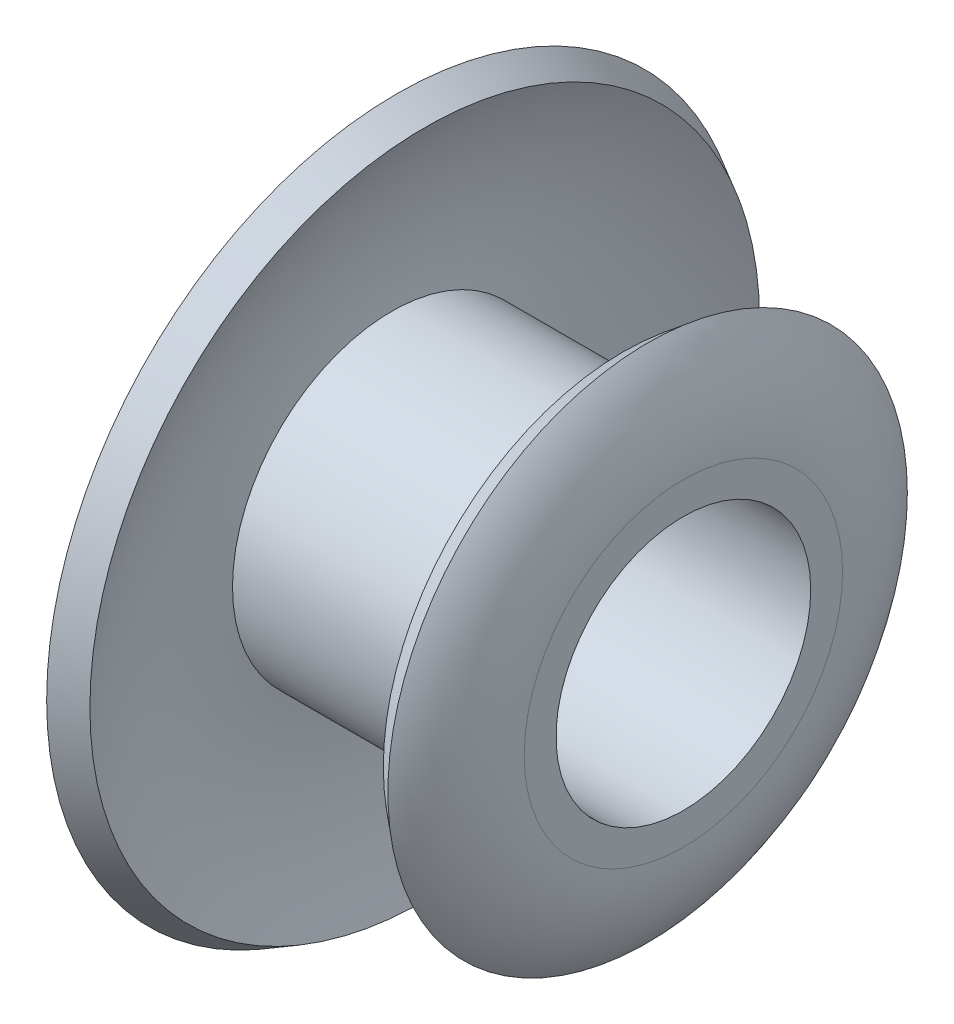
ISO-10303-21;
HEADER;
FILE_DESCRIPTION(('STEP AP214'),'2;1');
FILE_NAME('part.step','',(''),(''),'','','');
FILE_SCHEMA(('AUTOMOTIVE_DESIGN { 1 0 10303 214 1 1 1 1 }'));
ENDSEC;
DATA;
#1=APPLICATION_CONTEXT('core data for automotive mechanical design processes');
#2=APPLICATION_PROTOCOL_DEFINITION('international standard','automotive_design',2000,#1);
#3=PRODUCT_CONTEXT('',#1,'mechanical');
#4=PRODUCT('Part','Part','',(#3));
#5=PRODUCT_RELATED_PRODUCT_CATEGORY('part','',(#4));
#6=PRODUCT_DEFINITION_FORMATION('','',#4);
#7=PRODUCT_DEFINITION_CONTEXT('part definition',#1,'design');
#8=PRODUCT_DEFINITION('design','',#6,#7);
#9=PRODUCT_DEFINITION_SHAPE('','',#8);
#10=(LENGTH_UNIT() NAMED_UNIT(*) SI_UNIT(.MILLI.,.METRE.));
#11=(NAMED_UNIT(*) PLANE_ANGLE_UNIT() SI_UNIT($,.RADIAN.));
#12=(NAMED_UNIT(*) SI_UNIT($,.STERADIAN.) SOLID_ANGLE_UNIT());
#13=UNCERTAINTY_MEASURE_WITH_UNIT(LENGTH_MEASURE(1.E-05),#10,'distance_accuracy_value','');
#14=(GEOMETRIC_REPRESENTATION_CONTEXT(3) GLOBAL_UNCERTAINTY_ASSIGNED_CONTEXT((#13)) GLOBAL_UNIT_ASSIGNED_CONTEXT((#10,
#11,#12)) REPRESENTATION_CONTEXT('',''));
#15=CARTESIAN_POINT('',(0.,0.,0.));
#16=DIRECTION('',(0.,0.,1.));
#17=DIRECTION('',(1.,0.,0.));
#18=AXIS2_PLACEMENT_3D('',#15,#16,#17);
#19=CARTESIAN_POINT('',(-1.,0.,0.));
#20=DIRECTION('',(1.,0.,0.));
#21=DIRECTION('',(0.,0.,-1.));
#22=AXIS2_PLACEMENT_3D('',#19,#20,#21);
#23=TOROIDAL_SURFACE('',#22,1.25,1.);
#24=CARTESIAN_POINT('',(-0.224797408225479,0.,0.));
#25=DIRECTION('',(1.,0.,0.));
#26=DIRECTION('',(0.,0.,-1.));
#27=AXIS2_PLACEMENT_3D('',#24,#25,#26);
#28=CIRCLE('',#27,1.88171270503771);
#29=CARTESIAN_POINT('',(-0.224797408225479,0.,-1.88171270503771));
#30=VERTEX_POINT('',#29);
#31=EDGE_CURVE('E80',#30,#30,#28,.T.);
#32=ORIENTED_EDGE('',*,*,#31,.F.);
#33=EDGE_LOOP('',(#32));
#34=FACE_BOUND('',#33,.T.);
#35=CARTESIAN_POINT('',(0.,0.,0.));
#36=DIRECTION('',(1.,0.,0.));
#37=DIRECTION('',(0.,0.,-1.));
#38=AXIS2_PLACEMENT_3D('',#35,#36,#37);
#39=CIRCLE('',#38,1.25);
#40=CARTESIAN_POINT('',(0.,0.,-1.25));
#41=VERTEX_POINT('',#40);
#42=EDGE_CURVE('E10',#41,#41,#39,.T.);
#43=ORIENTED_EDGE('',*,*,#42,.T.);
#44=EDGE_LOOP('',(#43));
#45=FACE_BOUND('',#44,.T.);
#46=ADVANCED_FACE('F39',(#34,#45),#23,.F.);
#47=CARTESIAN_POINT('',(0.,0.,0.));
#48=DIRECTION('',(1.,0.,0.));
#49=DIRECTION('',(0.,0.,-1.));
#50=AXIS2_PLACEMENT_3D('',#47,#48,#49);
#51=CYLINDRICAL_SURFACE('',#50,1.25);
#52=ORIENTED_EDGE('',*,*,#42,.F.);
#53=EDGE_LOOP('',(#52));
#54=FACE_BOUND('',#53,.T.);
#55=CARTESIAN_POINT('',(-2.04063984282907,0.,0.));
#56=DIRECTION('',(1.,0.,0.));
#57=DIRECTION('',(0.,0.,-1.));
#58=AXIS2_PLACEMENT_3D('',#55,#56,#57);
#59=CIRCLE('',#58,1.25);
#60=CARTESIAN_POINT('',(-2.04063984282907,0.,-1.25));
#61=VERTEX_POINT('',#60);
#62=EDGE_CURVE('E46',#61,#61,#59,.T.);
#63=ORIENTED_EDGE('',*,*,#62,.T.);
#64=EDGE_LOOP('',(#63));
#65=FACE_BOUND('',#64,.T.);
#66=ADVANCED_FACE('F89',(#54,#65),#51,.T.);
#67=CARTESIAN_POINT('',(0.190032397181517,0.,0.));
#68=DIRECTION('',(1.,0.,0.));
#69=DIRECTION('',(0.,0.,-1.));
#70=AXIS2_PLACEMENT_3D('',#67,#68,#69);
#71=DEGENERATE_TOROIDAL_SURFACE('',#70,1.54428108611693,2.25,.T.);
#72=CARTESIAN_POINT('',(-1.78099676028185,0.,0.));
#73=DIRECTION('',(1.,0.,0.));
#74=DIRECTION('',(0.,0.,-1.));
#75=AXIS2_PLACEMENT_3D('',#72,#73,#74);
#76=CIRCLE('',#75,2.62942810861169);
#77=CARTESIAN_POINT('',(-1.78099676028185,0.,-2.62942810861169));
#78=VERTEX_POINT('',#77);
#79=EDGE_CURVE('E52',#78,#78,#76,.T.);
#80=ORIENTED_EDGE('',*,*,#79,.T.);
#81=EDGE_LOOP('',(#80));
#82=FACE_BOUND('',#81,.T.);
#83=ORIENTED_EDGE('',*,*,#62,.F.);
#84=EDGE_LOOP('',(#83));
#85=FACE_BOUND('',#84,.T.);
#86=ADVANCED_FACE('F93',(#82,#85),#71,.F.);
#87=CARTESIAN_POINT('',(-2.,0.,0.));
#88=DIRECTION('',(-1.,0.,0.));
#89=DIRECTION('',(0.,0.,1.));
#90=AXIS2_PLACEMENT_3D('',#87,#88,#89);
#91=CONICAL_SURFACE('',#90,2.75,0.503264178510874);
#92=ORIENTED_EDGE('',*,*,#79,.F.);
#93=EDGE_LOOP('',(#92));
#94=FACE_BOUND('',#93,.T.);
#95=CARTESIAN_POINT('',(-2.,0.,0.));
#96=DIRECTION('',(1.,0.,0.));
#97=DIRECTION('',(0.,0.,-1.));
#98=AXIS2_PLACEMENT_3D('',#95,#96,#97);
#99=CIRCLE('',#98,2.75);
#100=CARTESIAN_POINT('',(-2.,0.,-2.75));
#101=VERTEX_POINT('',#100);
#102=EDGE_CURVE('E58',#101,#101,#99,.T.);
#103=ORIENTED_EDGE('',*,*,#102,.T.);
#104=EDGE_LOOP('',(#103));
#105=FACE_BOUND('',#104,.T.);
#106=ADVANCED_FACE('F98',(#94,#105),#91,.T.);
#107=CARTESIAN_POINT('',(0.190032397181517,0.,0.));
#108=DIRECTION('',(1.,0.,0.));
#109=DIRECTION('',(0.,0.,-1.));
#110=AXIS2_PLACEMENT_3D('',#107,#108,#109);
#111=DEGENERATE_TOROIDAL_SURFACE('',#110,1.54428108611693,2.5,.T.);
#112=ORIENTED_EDGE('',*,*,#102,.F.);
#113=EDGE_LOOP('',(#112));
#114=FACE_BOUND('',#113,.T.);
#115=CARTESIAN_POINT('',(-2.25,0.,0.));
#116=DIRECTION('',(1.,0.,0.));
#117=DIRECTION('',(0.,0.,-1.));
#118=AXIS2_PLACEMENT_3D('',#115,#116,#117);
#119=CIRCLE('',#118,1.);
#120=CARTESIAN_POINT('',(-2.25,0.,-1.));
#121=VERTEX_POINT('',#120);
#122=EDGE_CURVE('E64',#121,#121,#119,.T.);
#123=ORIENTED_EDGE('',*,*,#122,.T.);
#124=EDGE_LOOP('',(#123));
#125=FACE_BOUND('',#124,.T.);
#126=ADVANCED_FACE('F104',(#114,#125),#111,.T.);
#127=CARTESIAN_POINT('',(0.,0.,0.));
#128=DIRECTION('',(1.,0.,0.));
#129=DIRECTION('',(0.,0.,-1.));
#130=AXIS2_PLACEMENT_3D('',#127,#128,#129);
#131=CYLINDRICAL_SURFACE('',#130,1.);
#132=ORIENTED_EDGE('',*,*,#122,.F.);
#133=EDGE_LOOP('',(#132));
#134=FACE_BOUND('',#133,.T.);
#135=CARTESIAN_POINT('',(0.25,0.,0.));
#136=DIRECTION('',(1.,0.,0.));
#137=DIRECTION('',(0.,0.,-1.));
#138=AXIS2_PLACEMENT_3D('',#135,#136,#137);
#139=CIRCLE('',#138,1.);
#140=CARTESIAN_POINT('',(0.25,0.,-1.));
#141=VERTEX_POINT('',#140);
#142=EDGE_CURVE('E68',#141,#141,#139,.T.);
#143=ORIENTED_EDGE('',*,*,#142,.T.);
#144=EDGE_LOOP('',(#143));
#145=FACE_BOUND('',#144,.T.);
#146=ADVANCED_FACE('F108',(#134,#145),#131,.F.);
#147=CARTESIAN_POINT('',(0.25,0.,0.));
#148=DIRECTION('',(1.,0.,0.));
#149=DIRECTION('',(0.,0.,-1.));
#150=AXIS2_PLACEMENT_3D('',#147,#148,#149);
#151=PLANE('',#150);
#152=CARTESIAN_POINT('',(0.25,0.,0.));
#153=DIRECTION('',(1.,0.,0.));
#154=DIRECTION('',(0.,0.,-1.));
#155=AXIS2_PLACEMENT_3D('',#152,#153,#154);
#156=CIRCLE('',#155,1.25);
#157=CARTESIAN_POINT('',(0.25,0.,-1.25));
#158=VERTEX_POINT('',#157);
#159=EDGE_CURVE('E72',#158,#158,#156,.T.);
#160=ORIENTED_EDGE('',*,*,#159,.T.);
#161=EDGE_LOOP('',(#160));
#162=FACE_BOUND('',#161,.T.);
#163=ORIENTED_EDGE('',*,*,#142,.F.);
#164=EDGE_LOOP('',(#163));
#165=FACE_BOUND('',#164,.T.);
#166=ADVANCED_FACE('F112',(#162,#165),#151,.T.);
#167=CARTESIAN_POINT('',(-1.,0.,0.));
#168=DIRECTION('',(1.,0.,0.));
#169=DIRECTION('',(0.,0.,-1.));
#170=AXIS2_PLACEMENT_3D('',#167,#168,#169);
#171=DEGENERATE_TOROIDAL_SURFACE('',#170,1.25,1.25,.T.);
#172=CARTESIAN_POINT('',(-0.0309967602818483,0.,0.));
#173=DIRECTION('',(1.,0.,0.));
#174=DIRECTION('',(0.,0.,-1.));
#175=AXIS2_PLACEMENT_3D('',#172,#173,#174);
#176=CIRCLE('',#175,2.03964088129714);
#177=CARTESIAN_POINT('',(-0.0309967602818483,0.,-2.03964088129714));
#178=VERTEX_POINT('',#177);
#179=EDGE_CURVE('E76',#178,#178,#176,.T.);
#180=ORIENTED_EDGE('',*,*,#179,.T.);
#181=EDGE_LOOP('',(#180));
#182=FACE_BOUND('',#181,.T.);
#183=ORIENTED_EDGE('',*,*,#159,.F.);
#184=EDGE_LOOP('',(#183));
#185=FACE_BOUND('',#184,.T.);
#186=ADVANCED_FACE('F116',(#182,#185),#171,.T.);
#187=CARTESIAN_POINT('',(-0.224797408225479,0.,0.));
#188=DIRECTION('',(1.,0.,0.));
#189=DIRECTION('',(0.,0.,-1.));
#190=AXIS2_PLACEMENT_3D('',#187,#188,#189);
#191=CONICAL_SURFACE('',#190,1.88171270503771,0.683760592480567);
#192=ORIENTED_EDGE('',*,*,#179,.F.);
#193=EDGE_LOOP('',(#192));
#194=FACE_BOUND('',#193,.T.);
#195=ORIENTED_EDGE('',*,*,#31,.T.);
#196=EDGE_LOOP('',(#195));
#197=FACE_BOUND('',#196,.T.);
#198=ADVANCED_FACE('F86',(#194,#197),#191,.T.);
#199=CLOSED_SHELL('',(#46,#66,#86,#106,#126,#146,#166,#186,#198));
#200=MANIFOLD_SOLID_BREP('B2',#199);
#201=ADVANCED_BREP_SHAPE_REPRESENTATION('',(#18,#200),#14);
#202=SHAPE_DEFINITION_REPRESENTATION(#9,#201);
ENDSEC;
END-ISO-10303-21;
